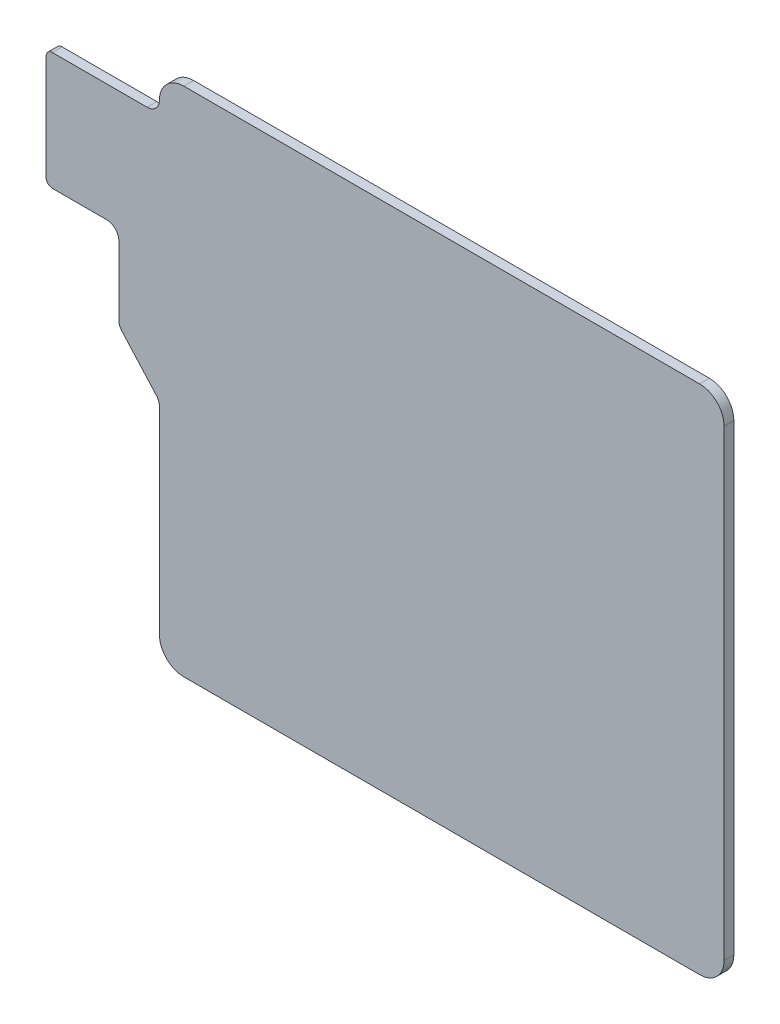
ISO-10303-21;
HEADER;
FILE_DESCRIPTION(('STEP AP214'),'2;1');
FILE_NAME('part.step','',(''),(''),'','','');
FILE_SCHEMA(('AUTOMOTIVE_DESIGN { 1 0 10303 214 1 1 1 1 }'));
ENDSEC;
DATA;
#1=APPLICATION_CONTEXT('core data for automotive mechanical design processes');
#2=APPLICATION_PROTOCOL_DEFINITION('international standard','automotive_design',2000,#1);
#3=PRODUCT_CONTEXT('',#1,'mechanical');
#4=PRODUCT('Part','Part','',(#3));
#5=PRODUCT_RELATED_PRODUCT_CATEGORY('part','',(#4));
#6=PRODUCT_DEFINITION_FORMATION('','',#4);
#7=PRODUCT_DEFINITION_CONTEXT('part definition',#1,'design');
#8=PRODUCT_DEFINITION('design','',#6,#7);
#9=PRODUCT_DEFINITION_SHAPE('','',#8);
#10=(LENGTH_UNIT() NAMED_UNIT(*) SI_UNIT(.MILLI.,.METRE.));
#11=(NAMED_UNIT(*) PLANE_ANGLE_UNIT() SI_UNIT($,.RADIAN.));
#12=(NAMED_UNIT(*) SI_UNIT($,.STERADIAN.) SOLID_ANGLE_UNIT());
#13=UNCERTAINTY_MEASURE_WITH_UNIT(LENGTH_MEASURE(1.E-05),#10,'distance_accuracy_value','');
#14=(GEOMETRIC_REPRESENTATION_CONTEXT(3) GLOBAL_UNCERTAINTY_ASSIGNED_CONTEXT((#13)) GLOBAL_UNIT_ASSIGNED_CONTEXT((#10,
#11,#12)) REPRESENTATION_CONTEXT('',''));
#15=CARTESIAN_POINT('',(0.,0.,0.));
#16=DIRECTION('',(0.,0.,1.));
#17=DIRECTION('',(1.,0.,0.));
#18=AXIS2_PLACEMENT_3D('',#15,#16,#17);
#19=CARTESIAN_POINT('',(21.9068913831102,0.593864401539017,1.6));
#20=DIRECTION('',(0.,0.,-1.));
#21=DIRECTION('',(-1.,0.,0.));
#22=AXIS2_PLACEMENT_3D('',#19,#20,#21);
#23=CYLINDRICAL_SURFACE('',#22,4.);
#24=CARTESIAN_POINT('',(21.9068913831102,0.593864401539017,0.));
#25=DIRECTION('',(0.,0.,1.));
#26=DIRECTION('',(-1.,0.,0.));
#27=AXIS2_PLACEMENT_3D('',#24,#25,#26);
#28=CIRCLE('',#27,4.);
#29=CARTESIAN_POINT('',(17.9068913831102,0.593864401539017,0.));
#30=VERTEX_POINT('',#29);
#31=CARTESIAN_POINT('',(21.9068913831102,-3.40613559846098,0.));
#32=VERTEX_POINT('',#31);
#33=EDGE_CURVE('E199',#30,#32,#28,.T.);
#34=ORIENTED_EDGE('',*,*,#33,.T.);
#35=DIRECTION('',(0.,0.,-1.));
#36=VECTOR('',#35,1.);
#37=CARTESIAN_POINT('',(21.9068913831102,-3.40613559846098,1.6));
#38=LINE('',#37,#36);
#39=CARTESIAN_POINT('',(21.9068913831102,-3.40613559846098,1.6));
#40=VERTEX_POINT('',#39);
#41=EDGE_CURVE('E11',#40,#32,#38,.T.);
#42=ORIENTED_EDGE('',*,*,#41,.F.);
#43=CARTESIAN_POINT('',(21.9068913831102,0.593864401539017,1.6));
#44=DIRECTION('',(0.,0.,1.));
#45=DIRECTION('',(-1.,0.,0.));
#46=AXIS2_PLACEMENT_3D('',#43,#44,#45);
#47=CIRCLE('',#46,4.);
#48=CARTESIAN_POINT('',(17.9068913831102,0.593864401539017,1.6));
#49=VERTEX_POINT('',#48);
#50=EDGE_CURVE('E235',#49,#40,#47,.T.);
#51=ORIENTED_EDGE('',*,*,#50,.F.);
#52=DIRECTION('',(0.,0.,-1.));
#53=VECTOR('',#52,1.);
#54=CARTESIAN_POINT('',(17.9068913831102,0.593864401539017,1.6));
#55=LINE('',#54,#53);
#56=EDGE_CURVE('E195',#49,#30,#55,.T.);
#57=ORIENTED_EDGE('',*,*,#56,.T.);
#58=EDGE_LOOP('',(#34,#42,#51,#57));
#59=FACE_BOUND('',#58,.T.);
#60=ADVANCED_FACE('F37',(#59),#23,.T.);
#61=CARTESIAN_POINT('',(21.9068913831102,-3.40613559846098,1.6));
#62=DIRECTION('',(0.,1.,0.));
#63=DIRECTION('',(-1.,0.,0.));
#64=AXIS2_PLACEMENT_3D('',#61,#62,#63);
#65=PLANE('',#64);
#66=DIRECTION('',(1.,0.,0.));
#67=VECTOR('',#66,1.);
#68=CARTESIAN_POINT('',(21.9068913831102,-3.40613559846098,0.));
#69=LINE('',#68,#67);
#70=CARTESIAN_POINT('',(106.36289138311,-3.40613559846098,0.));
#71=VERTEX_POINT('',#70);
#72=EDGE_CURVE('E202',#32,#71,#69,.T.);
#73=ORIENTED_EDGE('',*,*,#72,.T.);
#74=DIRECTION('',(0.,0.,-1.));
#75=VECTOR('',#74,1.);
#76=CARTESIAN_POINT('',(106.36289138311,-3.40613559846098,1.6));
#77=LINE('',#76,#75);
#78=CARTESIAN_POINT('',(106.36289138311,-3.40613559846098,1.6));
#79=VERTEX_POINT('',#78);
#80=EDGE_CURVE('E45',#79,#71,#77,.T.);
#81=ORIENTED_EDGE('',*,*,#80,.F.);
#82=DIRECTION('',(1.,0.,0.));
#83=VECTOR('',#82,1.);
#84=CARTESIAN_POINT('',(21.9068913831102,-3.40613559846098,1.6));
#85=LINE('',#84,#83);
#86=EDGE_CURVE('E129',#40,#79,#85,.T.);
#87=ORIENTED_EDGE('',*,*,#86,.F.);
#88=ORIENTED_EDGE('',*,*,#41,.T.);
#89=EDGE_LOOP('',(#73,#81,#87,#88));
#90=FACE_BOUND('',#89,.T.);
#91=ADVANCED_FACE('F348',(#90),#65,.F.);
#92=CARTESIAN_POINT('',(106.36289138311,0.593864401539021,1.6));
#93=DIRECTION('',(0.,0.,-1.));
#94=DIRECTION('',(-1.,0.,0.));
#95=AXIS2_PLACEMENT_3D('',#92,#93,#94);
#96=CYLINDRICAL_SURFACE('',#95,4.);
#97=CARTESIAN_POINT('',(106.36289138311,0.593864401539021,0.));
#98=DIRECTION('',(0.,0.,1.));
#99=DIRECTION('',(1.,0.,0.));
#100=AXIS2_PLACEMENT_3D('',#97,#98,#99);
#101=CIRCLE('',#100,4.);
#102=CARTESIAN_POINT('',(110.36289138311,0.593864401539021,0.));
#103=VERTEX_POINT('',#102);
#104=EDGE_CURVE('E204',#71,#103,#101,.T.);
#105=ORIENTED_EDGE('',*,*,#104,.T.);
#106=DIRECTION('',(0.,0.,-1.));
#107=VECTOR('',#106,1.);
#108=CARTESIAN_POINT('',(110.36289138311,0.593864401539021,1.6));
#109=LINE('',#108,#107);
#110=CARTESIAN_POINT('',(110.36289138311,0.593864401539021,1.6));
#111=VERTEX_POINT('',#110);
#112=EDGE_CURVE('E275',#111,#103,#109,.T.);
#113=ORIENTED_EDGE('',*,*,#112,.F.);
#114=CARTESIAN_POINT('',(106.36289138311,0.593864401539021,1.6));
#115=DIRECTION('',(0.,0.,1.));
#116=DIRECTION('',(1.,0.,0.));
#117=AXIS2_PLACEMENT_3D('',#114,#115,#116);
#118=CIRCLE('',#117,4.);
#119=EDGE_CURVE('E283',#79,#111,#118,.T.);
#120=ORIENTED_EDGE('',*,*,#119,.F.);
#121=ORIENTED_EDGE('',*,*,#80,.T.);
#122=EDGE_LOOP('',(#105,#113,#120,#121));
#123=FACE_BOUND('',#122,.T.);
#124=ADVANCED_FACE('F281',(#123),#96,.T.);
#125=CARTESIAN_POINT('',(110.36289138311,0.593864401539021,1.6));
#126=DIRECTION('',(-1.,0.,0.));
#127=DIRECTION('',(0.,0.,1.));
#128=AXIS2_PLACEMENT_3D('',#125,#126,#127);
#129=PLANE('',#128);
#130=DIRECTION('',(0.,1.,0.));
#131=VECTOR('',#130,1.);
#132=CARTESIAN_POINT('',(110.36289138311,0.593864401539021,0.));
#133=LINE('',#132,#131);
#134=CARTESIAN_POINT('',(110.36289138311,76.363864401539,0.));
#135=VERTEX_POINT('',#134);
#136=EDGE_CURVE('E206',#103,#135,#133,.T.);
#137=ORIENTED_EDGE('',*,*,#136,.T.);
#138=DIRECTION('',(0.,0.,-1.));
#139=VECTOR('',#138,1.);
#140=CARTESIAN_POINT('',(110.36289138311,76.363864401539,1.6));
#141=LINE('',#140,#139);
#142=CARTESIAN_POINT('',(110.36289138311,76.363864401539,1.6));
#143=VERTEX_POINT('',#142);
#144=EDGE_CURVE('E272',#143,#135,#141,.T.);
#145=ORIENTED_EDGE('',*,*,#144,.F.);
#146=DIRECTION('',(0.,1.,0.));
#147=VECTOR('',#146,1.);
#148=CARTESIAN_POINT('',(110.36289138311,0.593864401539021,1.6));
#149=LINE('',#148,#147);
#150=EDGE_CURVE('E301',#111,#143,#149,.T.);
#151=ORIENTED_EDGE('',*,*,#150,.F.);
#152=ORIENTED_EDGE('',*,*,#112,.T.);
#153=EDGE_LOOP('',(#137,#145,#151,#152));
#154=FACE_BOUND('',#153,.T.);
#155=ADVANCED_FACE('F292',(#154),#129,.F.);
#156=CARTESIAN_POINT('',(106.36289138311,76.363864401539,1.6));
#157=DIRECTION('',(0.,0.,-1.));
#158=DIRECTION('',(-1.,0.,0.));
#159=AXIS2_PLACEMENT_3D('',#156,#157,#158);
#160=CYLINDRICAL_SURFACE('',#159,4.);
#161=CARTESIAN_POINT('',(106.36289138311,76.363864401539,0.));
#162=DIRECTION('',(0.,0.,1.));
#163=DIRECTION('',(1.,0.,0.));
#164=AXIS2_PLACEMENT_3D('',#161,#162,#163);
#165=CIRCLE('',#164,4.);
#166=CARTESIAN_POINT('',(106.36289138311,80.363864401539,0.));
#167=VERTEX_POINT('',#166);
#168=EDGE_CURVE('E208',#135,#167,#165,.T.);
#169=ORIENTED_EDGE('',*,*,#168,.T.);
#170=DIRECTION('',(0.,0.,-1.));
#171=VECTOR('',#170,1.);
#172=CARTESIAN_POINT('',(106.36289138311,80.363864401539,1.6));
#173=LINE('',#172,#171);
#174=CARTESIAN_POINT('',(106.36289138311,80.363864401539,1.6));
#175=VERTEX_POINT('',#174);
#176=EDGE_CURVE('E269',#175,#167,#173,.T.);
#177=ORIENTED_EDGE('',*,*,#176,.F.);
#178=CARTESIAN_POINT('',(106.36289138311,76.363864401539,1.6));
#179=DIRECTION('',(0.,0.,1.));
#180=DIRECTION('',(1.,0.,0.));
#181=AXIS2_PLACEMENT_3D('',#178,#179,#180);
#182=CIRCLE('',#181,4.);
#183=EDGE_CURVE('E298',#143,#175,#182,.T.);
#184=ORIENTED_EDGE('',*,*,#183,.F.);
#185=ORIENTED_EDGE('',*,*,#144,.T.);
#186=EDGE_LOOP('',(#169,#177,#184,#185));
#187=FACE_BOUND('',#186,.T.);
#188=ADVANCED_FACE('F296',(#187),#160,.T.);
#189=CARTESIAN_POINT('',(106.36289138311,80.363864401539,1.6));
#190=DIRECTION('',(0.,-1.,0.));
#191=DIRECTION('',(1.,0.,0.));
#192=AXIS2_PLACEMENT_3D('',#189,#190,#191);
#193=PLANE('',#192);
#194=DIRECTION('',(-1.,0.,0.));
#195=VECTOR('',#194,1.);
#196=CARTESIAN_POINT('',(106.36289138311,80.363864401539,0.));
#197=LINE('',#196,#195);
#198=CARTESIAN_POINT('',(21.9067913831102,80.363864401539,0.));
#199=VERTEX_POINT('',#198);
#200=EDGE_CURVE('E210',#167,#199,#197,.T.);
#201=ORIENTED_EDGE('',*,*,#200,.T.);
#202=DIRECTION('',(0.,0.,-1.));
#203=VECTOR('',#202,1.);
#204=CARTESIAN_POINT('',(21.9067913831102,80.363864401539,1.6));
#205=LINE('',#204,#203);
#206=CARTESIAN_POINT('',(21.9067913831102,80.363864401539,1.6));
#207=VERTEX_POINT('',#206);
#208=EDGE_CURVE('E266',#207,#199,#205,.T.);
#209=ORIENTED_EDGE('',*,*,#208,.F.);
#210=DIRECTION('',(-1.,0.,0.));
#211=VECTOR('',#210,1.);
#212=CARTESIAN_POINT('',(106.36289138311,80.363864401539,1.6));
#213=LINE('',#212,#211);
#214=EDGE_CURVE('E300',#175,#207,#213,.T.);
#215=ORIENTED_EDGE('',*,*,#214,.F.);
#216=ORIENTED_EDGE('',*,*,#176,.T.);
#217=EDGE_LOOP('',(#201,#209,#215,#216));
#218=FACE_BOUND('',#217,.T.);
#219=ADVANCED_FACE('F361',(#218),#193,.F.);
#220=CARTESIAN_POINT('',(21.9067913831102,76.363864401539,1.6));
#221=DIRECTION('',(0.,0.,-1.));
#222=DIRECTION('',(-1.,0.,0.));
#223=AXIS2_PLACEMENT_3D('',#220,#221,#222);
#224=CYLINDRICAL_SURFACE('',#223,4.);
#225=CARTESIAN_POINT('',(21.9067913831102,76.363864401539,0.));
#226=DIRECTION('',(0.,0.,1.));
#227=DIRECTION('',(1.,0.,0.));
#228=AXIS2_PLACEMENT_3D('',#225,#226,#227);
#229=CIRCLE('',#228,4.);
#230=CARTESIAN_POINT('',(17.9067913831102,76.363864401539,0.));
#231=VERTEX_POINT('',#230);
#232=EDGE_CURVE('E212',#199,#231,#229,.T.);
#233=ORIENTED_EDGE('',*,*,#232,.T.);
#234=DIRECTION('',(0.,0.,-1.));
#235=VECTOR('',#234,1.);
#236=CARTESIAN_POINT('',(17.9067913831102,76.363864401539,1.6));
#237=LINE('',#236,#235);
#238=CARTESIAN_POINT('',(17.9067913831102,76.363864401539,1.6));
#239=VERTEX_POINT('',#238);
#240=EDGE_CURVE('E263',#239,#231,#237,.T.);
#241=ORIENTED_EDGE('',*,*,#240,.F.);
#242=CARTESIAN_POINT('',(21.9067913831102,76.363864401539,1.6));
#243=DIRECTION('',(0.,0.,1.));
#244=DIRECTION('',(1.,0.,0.));
#245=AXIS2_PLACEMENT_3D('',#242,#243,#244);
#246=CIRCLE('',#245,4.);
#247=EDGE_CURVE('E303',#207,#239,#246,.T.);
#248=ORIENTED_EDGE('',*,*,#247,.F.);
#249=ORIENTED_EDGE('',*,*,#208,.T.);
#250=EDGE_LOOP('',(#233,#241,#248,#249));
#251=FACE_BOUND('',#250,.T.);
#252=ADVANCED_FACE('F364',(#251),#224,.T.);
#253=CARTESIAN_POINT('',(15.9067913831102,76.363864401539,1.6));
#254=DIRECTION('',(0.,0.,-1.));
#255=DIRECTION('',(-1.,0.,0.));
#256=AXIS2_PLACEMENT_3D('',#253,#254,#255);
#257=CYLINDRICAL_SURFACE('',#256,2.);
#258=CARTESIAN_POINT('',(15.9067913831102,76.363864401539,0.));
#259=DIRECTION('',(0.,0.,-1.));
#260=DIRECTION('',(-1.,0.,0.));
#261=AXIS2_PLACEMENT_3D('',#258,#259,#260);
#262=CIRCLE('',#261,2.);
#263=CARTESIAN_POINT('',(15.9067913831102,74.363864401539,0.));
#264=VERTEX_POINT('',#263);
#265=EDGE_CURVE('E214',#231,#264,#262,.T.);
#266=ORIENTED_EDGE('',*,*,#265,.T.);
#267=DIRECTION('',(0.,0.,-1.));
#268=VECTOR('',#267,1.);
#269=CARTESIAN_POINT('',(15.9067913831102,74.363864401539,1.6));
#270=LINE('',#269,#268);
#271=CARTESIAN_POINT('',(15.9067913831102,74.363864401539,1.6));
#272=VERTEX_POINT('',#271);
#273=EDGE_CURVE('E260',#272,#264,#270,.T.);
#274=ORIENTED_EDGE('',*,*,#273,.F.);
#275=CARTESIAN_POINT('',(15.9067913831102,76.363864401539,1.6));
#276=DIRECTION('',(0.,0.,-1.));
#277=DIRECTION('',(-1.,0.,0.));
#278=AXIS2_PLACEMENT_3D('',#275,#276,#277);
#279=CIRCLE('',#278,2.);
#280=EDGE_CURVE('E309',#239,#272,#279,.T.);
#281=ORIENTED_EDGE('',*,*,#280,.F.);
#282=ORIENTED_EDGE('',*,*,#240,.T.);
#283=EDGE_LOOP('',(#266,#274,#281,#282));
#284=FACE_BOUND('',#283,.T.);
#285=ADVANCED_FACE('F368',(#284),#257,.F.);
#286=CARTESIAN_POINT('',(15.9067913831102,74.363864401539,1.6));
#287=DIRECTION('',(0.,-1.,0.));
#288=DIRECTION('',(0.,0.,-1.));
#289=AXIS2_PLACEMENT_3D('',#286,#287,#288);
#290=PLANE('',#289);
#291=DIRECTION('',(-1.,0.,0.));
#292=VECTOR('',#291,1.);
#293=CARTESIAN_POINT('',(15.9067913831102,74.363864401539,0.));
#294=LINE('',#293,#292);
#295=CARTESIAN_POINT('',(0.364791383110206,74.363864401539,0.));
#296=VERTEX_POINT('',#295);
#297=EDGE_CURVE('E216',#264,#296,#294,.T.);
#298=ORIENTED_EDGE('',*,*,#297,.T.);
#299=DIRECTION('',(0.,0.,-1.));
#300=VECTOR('',#299,1.);
#301=CARTESIAN_POINT('',(0.364791383110206,74.363864401539,1.6));
#302=LINE('',#301,#300);
#303=CARTESIAN_POINT('',(0.364791383110206,74.363864401539,1.6));
#304=VERTEX_POINT('',#303);
#305=EDGE_CURVE('E257',#304,#296,#302,.T.);
#306=ORIENTED_EDGE('',*,*,#305,.F.);
#307=DIRECTION('',(-1.,0.,0.));
#308=VECTOR('',#307,1.);
#309=CARTESIAN_POINT('',(15.9067913831102,74.363864401539,1.6));
#310=LINE('',#309,#308);
#311=EDGE_CURVE('E311',#272,#304,#310,.T.);
#312=ORIENTED_EDGE('',*,*,#311,.F.);
#313=ORIENTED_EDGE('',*,*,#273,.T.);
#314=EDGE_LOOP('',(#298,#306,#312,#313));
#315=FACE_BOUND('',#314,.T.);
#316=ADVANCED_FACE('F372',(#315),#290,.F.);
#317=CARTESIAN_POINT('',(0.364791383110207,73.363864401539,1.6));
#318=DIRECTION('',(0.,0.,-1.));
#319=DIRECTION('',(-1.,0.,0.));
#320=AXIS2_PLACEMENT_3D('',#317,#318,#319);
#321=CYLINDRICAL_SURFACE('',#320,1.00000000000001);
#322=CARTESIAN_POINT('',(0.364791383110207,73.363864401539,0.));
#323=DIRECTION('',(0.,0.,1.));
#324=DIRECTION('',(1.,0.,0.));
#325=AXIS2_PLACEMENT_3D('',#322,#323,#324);
#326=CIRCLE('',#325,1.00000000000001);
#327=CARTESIAN_POINT('',(-0.635208616889801,73.363864401539,0.));
#328=VERTEX_POINT('',#327);
#329=EDGE_CURVE('E218',#296,#328,#326,.T.);
#330=ORIENTED_EDGE('',*,*,#329,.T.);
#331=DIRECTION('',(0.,0.,-1.));
#332=VECTOR('',#331,1.);
#333=CARTESIAN_POINT('',(-0.635208616889801,73.363864401539,1.6));
#334=LINE('',#333,#332);
#335=CARTESIAN_POINT('',(-0.635208616889801,73.363864401539,1.6));
#336=VERTEX_POINT('',#335);
#337=EDGE_CURVE('E254',#336,#328,#334,.T.);
#338=ORIENTED_EDGE('',*,*,#337,.F.);
#339=CARTESIAN_POINT('',(0.364791383110207,73.363864401539,1.6));
#340=DIRECTION('',(0.,0.,1.));
#341=DIRECTION('',(1.,0.,0.));
#342=AXIS2_PLACEMENT_3D('',#339,#340,#341);
#343=CIRCLE('',#342,1.00000000000001);
#344=EDGE_CURVE('E313',#304,#336,#343,.T.);
#345=ORIENTED_EDGE('',*,*,#344,.F.);
#346=ORIENTED_EDGE('',*,*,#305,.T.);
#347=EDGE_LOOP('',(#330,#338,#345,#346));
#348=FACE_BOUND('',#347,.T.);
#349=ADVANCED_FACE('F376',(#348),#321,.T.);
#350=CARTESIAN_POINT('',(-0.635208616889793,73.363864401539,1.6));
#351=DIRECTION('',(0.999999996115328,8.81438890945239E-05,0.));
#352=DIRECTION('',(-8.81438890945239E-05,0.999999996115328,0.));
#353=AXIS2_PLACEMENT_3D('',#350,#351,#352);
#354=PLANE('',#353);
#355=DIRECTION('',(8.81438890945239E-05,-0.999999996115328,0.));
#356=VECTOR('',#355,1.);
#357=CARTESIAN_POINT('',(-0.635208616889793,73.363864401539,0.));
#358=LINE('',#357,#356);
#359=CARTESIAN_POINT('',(-0.633687130449518,56.1024699929778,0.));
#360=VERTEX_POINT('',#359);
#361=EDGE_CURVE('E220',#328,#360,#358,.T.);
#362=ORIENTED_EDGE('',*,*,#361,.T.);
#363=DIRECTION('',(0.,0.,-1.));
#364=VECTOR('',#363,1.);
#365=CARTESIAN_POINT('',(-0.633687130449518,56.1024699929778,1.6));
#366=LINE('',#365,#364);
#367=CARTESIAN_POINT('',(-0.633687130449518,56.1024699929778,1.6));
#368=VERTEX_POINT('',#367);
#369=EDGE_CURVE('E251',#368,#360,#366,.T.);
#370=ORIENTED_EDGE('',*,*,#369,.F.);
#371=DIRECTION('',(8.81438890945239E-05,-0.999999996115328,0.));
#372=VECTOR('',#371,1.);
#373=CARTESIAN_POINT('',(-0.635208616889793,73.363864401539,1.6));
#374=LINE('',#373,#372);
#375=EDGE_CURVE('E315',#336,#368,#374,.T.);
#376=ORIENTED_EDGE('',*,*,#375,.F.);
#377=ORIENTED_EDGE('',*,*,#337,.T.);
#378=EDGE_LOOP('',(#362,#370,#376,#377));
#379=FACE_BOUND('',#378,.T.);
#380=ADVANCED_FACE('F380',(#379),#354,.F.);
#381=CARTESIAN_POINT('',(0.366312869550484,56.1024699929778,1.6));
#382=DIRECTION('',(0.,0.,-1.));
#383=DIRECTION('',(-1.,0.,0.));
#384=AXIS2_PLACEMENT_3D('',#381,#382,#383);
#385=CYLINDRICAL_SURFACE('',#384,1.);
#386=CARTESIAN_POINT('',(0.366312869550484,56.1024699929778,0.));
#387=DIRECTION('',(0.,0.,1.));
#388=DIRECTION('',(-1.,0.,0.));
#389=AXIS2_PLACEMENT_3D('',#386,#387,#388);
#390=CIRCLE('',#389,1.);
#391=CARTESIAN_POINT('',(0.366312869550483,55.1024699929778,0.));
#392=VERTEX_POINT('',#391);
#393=EDGE_CURVE('E222',#360,#392,#390,.T.);
#394=ORIENTED_EDGE('',*,*,#393,.T.);
#395=DIRECTION('',(0.,0.,-1.));
#396=VECTOR('',#395,1.);
#397=CARTESIAN_POINT('',(0.366312869550483,55.1024699929778,1.6));
#398=LINE('',#397,#396);
#399=CARTESIAN_POINT('',(0.366312869550483,55.1024699929778,1.6));
#400=VERTEX_POINT('',#399);
#401=EDGE_CURVE('E248',#400,#392,#398,.T.);
#402=ORIENTED_EDGE('',*,*,#401,.F.);
#403=CARTESIAN_POINT('',(0.366312869550484,56.1024699929778,1.6));
#404=DIRECTION('',(0.,0.,1.));
#405=DIRECTION('',(-1.,0.,0.));
#406=AXIS2_PLACEMENT_3D('',#403,#404,#405);
#407=CIRCLE('',#406,1.);
#408=EDGE_CURVE('E317',#368,#400,#407,.T.);
#409=ORIENTED_EDGE('',*,*,#408,.F.);
#410=ORIENTED_EDGE('',*,*,#369,.T.);
#411=EDGE_LOOP('',(#394,#402,#409,#410));
#412=FACE_BOUND('',#411,.T.);
#413=ADVANCED_FACE('F384',(#412),#385,.T.);
#414=CARTESIAN_POINT('',(9.26811286955048,55.1024699929778,1.6));
#415=DIRECTION('',(0.,1.,0.));
#416=DIRECTION('',(0.,0.,1.));
#417=AXIS2_PLACEMENT_3D('',#414,#415,#416);
#418=PLANE('',#417);
#419=DIRECTION('',(1.,0.,0.));
#420=VECTOR('',#419,1.);
#421=CARTESIAN_POINT('',(9.26811286955048,55.1024699929778,0.));
#422=LINE('',#421,#420);
#423=CARTESIAN_POINT('',(9.26811286955048,55.1024699929778,0.));
#424=VERTEX_POINT('',#423);
#425=EDGE_CURVE('E224',#392,#424,#422,.T.);
#426=ORIENTED_EDGE('',*,*,#425,.T.);
#427=DIRECTION('',(0.,0.,-1.));
#428=VECTOR('',#427,1.);
#429=CARTESIAN_POINT('',(9.26811286955048,55.1024699929778,1.6));
#430=LINE('',#429,#428);
#431=CARTESIAN_POINT('',(9.26811286955048,55.1024699929778,1.6));
#432=VERTEX_POINT('',#431);
#433=EDGE_CURVE('E245',#432,#424,#430,.T.);
#434=ORIENTED_EDGE('',*,*,#433,.F.);
#435=DIRECTION('',(1.,0.,0.));
#436=VECTOR('',#435,1.);
#437=CARTESIAN_POINT('',(9.26811286955048,55.1024699929778,1.6));
#438=LINE('',#437,#436);
#439=EDGE_CURVE('E319',#400,#432,#438,.T.);
#440=ORIENTED_EDGE('',*,*,#439,.F.);
#441=ORIENTED_EDGE('',*,*,#401,.T.);
#442=EDGE_LOOP('',(#426,#434,#440,#441));
#443=FACE_BOUND('',#442,.T.);
#444=ADVANCED_FACE('F388',(#443),#418,.F.);
#445=CARTESIAN_POINT('',(9.26811286955049,53.1024699929778,1.6));
#446=DIRECTION('',(0.,0.,-1.));
#447=DIRECTION('',(-1.,0.,0.));
#448=AXIS2_PLACEMENT_3D('',#445,#446,#447);
#449=CYLINDRICAL_SURFACE('',#448,2.);
#450=CARTESIAN_POINT('',(9.26811286955049,53.1024699929778,0.));
#451=DIRECTION('',(0.,0.,-1.));
#452=DIRECTION('',(1.,0.,0.));
#453=AXIS2_PLACEMENT_3D('',#450,#451,#452);
#454=CIRCLE('',#453,2.);
#455=CARTESIAN_POINT('',(11.2681128695505,53.1024699929778,0.));
#456=VERTEX_POINT('',#455);
#457=EDGE_CURVE('E226',#424,#456,#454,.T.);
#458=ORIENTED_EDGE('',*,*,#457,.T.);
#459=DIRECTION('',(0.,0.,-1.));
#460=VECTOR('',#459,1.);
#461=CARTESIAN_POINT('',(11.2681128695505,53.1024699929778,1.6));
#462=LINE('',#461,#460);
#463=CARTESIAN_POINT('',(11.2681128695505,53.1024699929778,1.6));
#464=VERTEX_POINT('',#463);
#465=EDGE_CURVE('E242',#464,#456,#462,.T.);
#466=ORIENTED_EDGE('',*,*,#465,.F.);
#467=CARTESIAN_POINT('',(9.26811286955049,53.1024699929778,1.6));
#468=DIRECTION('',(0.,0.,-1.));
#469=DIRECTION('',(1.,0.,0.));
#470=AXIS2_PLACEMENT_3D('',#467,#468,#469);
#471=CIRCLE('',#470,2.);
#472=EDGE_CURVE('E321',#432,#464,#471,.T.);
#473=ORIENTED_EDGE('',*,*,#472,.F.);
#474=ORIENTED_EDGE('',*,*,#433,.T.);
#475=EDGE_LOOP('',(#458,#466,#473,#474));
#476=FACE_BOUND('',#475,.T.);
#477=ADVANCED_FACE('F392',(#476),#449,.F.);
#478=CARTESIAN_POINT('',(11.2681128695505,41.8682699929778,1.6));
#479=DIRECTION('',(1.,0.,0.));
#480=DIRECTION('',(0.,0.,-1.));
#481=AXIS2_PLACEMENT_3D('',#478,#479,#480);
#482=PLANE('',#481);
#483=DIRECTION('',(0.,-1.,0.));
#484=VECTOR('',#483,1.);
#485=CARTESIAN_POINT('',(11.2681128695505,41.8682699929778,0.));
#486=LINE('',#485,#484);
#487=CARTESIAN_POINT('',(11.2681128695505,41.8682699929778,0.));
#488=VERTEX_POINT('',#487);
#489=EDGE_CURVE('E228',#456,#488,#486,.T.);
#490=ORIENTED_EDGE('',*,*,#489,.T.);
#491=DIRECTION('',(0.,0.,-1.));
#492=VECTOR('',#491,1.);
#493=CARTESIAN_POINT('',(11.2681128695505,41.8682699929778,1.6));
#494=LINE('',#493,#492);
#495=CARTESIAN_POINT('',(11.2681128695505,41.8682699929778,1.6));
#496=VERTEX_POINT('',#495);
#497=EDGE_CURVE('E239',#496,#488,#494,.T.);
#498=ORIENTED_EDGE('',*,*,#497,.F.);
#499=DIRECTION('',(0.,-1.,0.));
#500=VECTOR('',#499,1.);
#501=CARTESIAN_POINT('',(11.2681128695505,41.8682699929778,1.6));
#502=LINE('',#501,#500);
#503=EDGE_CURVE('E323',#464,#496,#502,.T.);
#504=ORIENTED_EDGE('',*,*,#503,.F.);
#505=ORIENTED_EDGE('',*,*,#465,.T.);
#506=EDGE_LOOP('',(#490,#498,#504,#505));
#507=FACE_BOUND('',#506,.T.);
#508=ADVANCED_FACE('F329',(#507),#482,.F.);
#509=CARTESIAN_POINT('',(13.2681128695504,41.8682699929778,1.6));
#510=DIRECTION('',(0.,0.,-1.));
#511=DIRECTION('',(-1.,0.,0.));
#512=AXIS2_PLACEMENT_3D('',#509,#510,#511);
#513=CYLINDRICAL_SURFACE('',#512,1.99999999999994);
#514=CARTESIAN_POINT('',(13.2681128695504,41.8682699929778,0.));
#515=DIRECTION('',(0.,0.,1.));
#516=DIRECTION('',(-1.,0.,0.));
#517=AXIS2_PLACEMENT_3D('',#514,#515,#516);
#518=CIRCLE('',#517,1.99999999999994);
#519=CARTESIAN_POINT('',(11.7794897770882,40.5326048820357,0.));
#520=VERTEX_POINT('',#519);
#521=EDGE_CURVE('E230',#488,#520,#518,.T.);
#522=ORIENTED_EDGE('',*,*,#521,.T.);
#523=DIRECTION('',(0.,0.,-1.));
#524=VECTOR('',#523,1.);
#525=CARTESIAN_POINT('',(11.7794897770882,40.5326048820357,1.6));
#526=LINE('',#525,#524);
#527=CARTESIAN_POINT('',(11.7794897770882,40.5326048820357,1.6));
#528=VERTEX_POINT('',#527);
#529=EDGE_CURVE('E190',#528,#520,#526,.T.);
#530=ORIENTED_EDGE('',*,*,#529,.F.);
#531=CARTESIAN_POINT('',(13.2681128695504,41.8682699929778,1.6));
#532=DIRECTION('',(0.,0.,1.));
#533=DIRECTION('',(-1.,0.,0.));
#534=AXIS2_PLACEMENT_3D('',#531,#532,#533);
#535=CIRCLE('',#534,1.99999999999994);
#536=EDGE_CURVE('E181',#496,#528,#535,.T.);
#537=ORIENTED_EDGE('',*,*,#536,.F.);
#538=ORIENTED_EDGE('',*,*,#497,.T.);
#539=EDGE_LOOP('',(#522,#530,#537,#538));
#540=FACE_BOUND('',#539,.T.);
#541=ADVANCED_FACE('F333',(#540),#513,.T.);
#542=CARTESIAN_POINT('',(17.3309146776968,34.3454407228346,1.6));
#543=DIRECTION('',(0.744311546231156,0.667832555471044,0.));
#544=DIRECTION('',(-0.667832555471044,0.744311546231156,0.));
#545=AXIS2_PLACEMENT_3D('',#542,#543,#544);
#546=PLANE('',#545);
#547=DIRECTION('',(0.667832555471044,-0.744311546231156,0.));
#548=VECTOR('',#547,1.);
#549=CARTESIAN_POINT('',(17.3309146776968,34.3454407228346,0.));
#550=LINE('',#549,#548);
#551=CARTESIAN_POINT('',(17.3309146776968,34.3454407228346,0.));
#552=VERTEX_POINT('',#551);
#553=EDGE_CURVE('E189',#520,#552,#550,.T.);
#554=ORIENTED_EDGE('',*,*,#553,.T.);
#555=DIRECTION('',(0.,0.,-1.));
#556=VECTOR('',#555,1.);
#557=CARTESIAN_POINT('',(17.3309146776968,34.3454407228346,1.6));
#558=LINE('',#557,#556);
#559=CARTESIAN_POINT('',(17.3309146776968,34.3454407228346,1.6));
#560=VERTEX_POINT('',#559);
#561=EDGE_CURVE('E186',#560,#552,#558,.T.);
#562=ORIENTED_EDGE('',*,*,#561,.F.);
#563=DIRECTION('',(0.667832555471044,-0.744311546231156,0.));
#564=VECTOR('',#563,1.);
#565=CARTESIAN_POINT('',(17.3309146776968,34.3454407228346,1.6));
#566=LINE('',#565,#564);
#567=EDGE_CURVE('E175',#528,#560,#566,.T.);
#568=ORIENTED_EDGE('',*,*,#567,.F.);
#569=ORIENTED_EDGE('',*,*,#529,.T.);
#570=EDGE_LOOP('',(#554,#562,#568,#569));
#571=FACE_BOUND('',#570,.T.);
#572=ADVANCED_FACE('F187',(#571),#546,.F.);
#573=CARTESIAN_POINT('',(15.9067913831102,32.941064401539,1.6));
#574=DIRECTION('',(0.,0.,-1.));
#575=DIRECTION('',(-1.,0.,0.));
#576=AXIS2_PLACEMENT_3D('',#573,#574,#575);
#577=CYLINDRICAL_SURFACE('',#576,2.0001);
#578=CARTESIAN_POINT('',(15.9067913831102,32.941064401539,0.));
#579=DIRECTION('',(0.,0.,-1.));
#580=DIRECTION('',(1.,0.,0.));
#581=AXIS2_PLACEMENT_3D('',#578,#579,#580);
#582=CIRCLE('',#581,2.0001);
#583=CARTESIAN_POINT('',(17.9068913831102,32.941064401539,0.));
#584=VERTEX_POINT('',#583);
#585=EDGE_CURVE('E115',#552,#584,#582,.T.);
#586=ORIENTED_EDGE('',*,*,#585,.T.);
#587=DIRECTION('',(0.,0.,-1.));
#588=VECTOR('',#587,1.);
#589=CARTESIAN_POINT('',(17.9068913831102,32.941064401539,1.6));
#590=LINE('',#589,#588);
#591=CARTESIAN_POINT('',(17.9068913831102,32.941064401539,1.6));
#592=VERTEX_POINT('',#591);
#593=EDGE_CURVE('E191',#592,#584,#590,.T.);
#594=ORIENTED_EDGE('',*,*,#593,.F.);
#595=CARTESIAN_POINT('',(15.9067913831102,32.941064401539,1.6));
#596=DIRECTION('',(0.,0.,-1.));
#597=DIRECTION('',(1.,0.,0.));
#598=AXIS2_PLACEMENT_3D('',#595,#596,#597);
#599=CIRCLE('',#598,2.0001);
#600=EDGE_CURVE('E179',#560,#592,#599,.T.);
#601=ORIENTED_EDGE('',*,*,#600,.F.);
#602=ORIENTED_EDGE('',*,*,#561,.T.);
#603=EDGE_LOOP('',(#586,#594,#601,#602));
#604=FACE_BOUND('',#603,.T.);
#605=ADVANCED_FACE('F193',(#604),#577,.F.);
#606=CARTESIAN_POINT('',(17.9068913831102,0.593864401539017,1.6));
#607=DIRECTION('',(1.,0.,0.));
#608=DIRECTION('',(0.,0.,-1.));
#609=AXIS2_PLACEMENT_3D('',#606,#607,#608);
#610=PLANE('',#609);
#611=DIRECTION('',(0.,-1.,0.));
#612=VECTOR('',#611,1.);
#613=CARTESIAN_POINT('',(17.9068913831102,0.593864401539017,0.));
#614=LINE('',#613,#612);
#615=EDGE_CURVE('E121',#584,#30,#614,.T.);
#616=ORIENTED_EDGE('',*,*,#615,.T.);
#617=ORIENTED_EDGE('',*,*,#56,.F.);
#618=DIRECTION('',(0.,-1.,0.));
#619=VECTOR('',#618,1.);
#620=CARTESIAN_POINT('',(17.9068913831102,0.593864401539017,1.6));
#621=LINE('',#620,#619);
#622=EDGE_CURVE('E53',#592,#49,#621,.T.);
#623=ORIENTED_EDGE('',*,*,#622,.F.);
#624=ORIENTED_EDGE('',*,*,#593,.T.);
#625=EDGE_LOOP('',(#616,#617,#623,#624));
#626=FACE_BOUND('',#625,.T.);
#627=ADVANCED_FACE('F337',(#626),#610,.F.);
#628=CARTESIAN_POINT('',(21.9068913831102,0.593864401539017,1.6));
#629=DIRECTION('',(0.,0.,-1.));
#630=DIRECTION('',(-1.,0.,0.));
#631=AXIS2_PLACEMENT_3D('',#628,#629,#630);
#632=PLANE('',#631);
#633=ORIENTED_EDGE('',*,*,#50,.T.);
#634=ORIENTED_EDGE('',*,*,#86,.T.);
#635=ORIENTED_EDGE('',*,*,#119,.T.);
#636=ORIENTED_EDGE('',*,*,#150,.T.);
#637=ORIENTED_EDGE('',*,*,#183,.T.);
#638=ORIENTED_EDGE('',*,*,#214,.T.);
#639=ORIENTED_EDGE('',*,*,#247,.T.);
#640=ORIENTED_EDGE('',*,*,#280,.T.);
#641=ORIENTED_EDGE('',*,*,#311,.T.);
#642=ORIENTED_EDGE('',*,*,#344,.T.);
#643=ORIENTED_EDGE('',*,*,#375,.T.);
#644=ORIENTED_EDGE('',*,*,#408,.T.);
#645=ORIENTED_EDGE('',*,*,#439,.T.);
#646=ORIENTED_EDGE('',*,*,#472,.T.);
#647=ORIENTED_EDGE('',*,*,#503,.T.);
#648=ORIENTED_EDGE('',*,*,#536,.T.);
#649=ORIENTED_EDGE('',*,*,#567,.T.);
#650=ORIENTED_EDGE('',*,*,#600,.T.);
#651=ORIENTED_EDGE('',*,*,#622,.T.);
#652=EDGE_LOOP('',(#633,#634,#635,#636,#637,#638,#639,#640,#641,#642,#643,#644,#645,#646,#647,
#648,#649,#650,#651));
#653=FACE_BOUND('',#652,.T.);
#654=ADVANCED_FACE('F177',(#653),#632,.F.);
#655=CARTESIAN_POINT('',(21.9068913831102,0.593864401539017,0.));
#656=DIRECTION('',(0.,0.,-1.));
#657=DIRECTION('',(-1.,0.,0.));
#658=AXIS2_PLACEMENT_3D('',#655,#656,#657);
#659=PLANE('',#658);
#660=ORIENTED_EDGE('',*,*,#33,.F.);
#661=ORIENTED_EDGE('',*,*,#615,.F.);
#662=ORIENTED_EDGE('',*,*,#585,.F.);
#663=ORIENTED_EDGE('',*,*,#553,.F.);
#664=ORIENTED_EDGE('',*,*,#521,.F.);
#665=ORIENTED_EDGE('',*,*,#489,.F.);
#666=ORIENTED_EDGE('',*,*,#457,.F.);
#667=ORIENTED_EDGE('',*,*,#425,.F.);
#668=ORIENTED_EDGE('',*,*,#393,.F.);
#669=ORIENTED_EDGE('',*,*,#361,.F.);
#670=ORIENTED_EDGE('',*,*,#329,.F.);
#671=ORIENTED_EDGE('',*,*,#297,.F.);
#672=ORIENTED_EDGE('',*,*,#265,.F.);
#673=ORIENTED_EDGE('',*,*,#232,.F.);
#674=ORIENTED_EDGE('',*,*,#200,.F.);
#675=ORIENTED_EDGE('',*,*,#168,.F.);
#676=ORIENTED_EDGE('',*,*,#136,.F.);
#677=ORIENTED_EDGE('',*,*,#104,.F.);
#678=ORIENTED_EDGE('',*,*,#72,.F.);
#679=EDGE_LOOP('',(#660,#661,#662,#663,#664,#665,#666,#667,#668,#669,#670,#671,#672,#673,#674,
#675,#676,#677,#678));
#680=FACE_BOUND('',#679,.T.);
#681=ADVANCED_FACE('F287',(#680),#659,.T.);
#682=CLOSED_SHELL('',(#60,#91,#124,#155,#188,#219,#252,#285,#316,#349,#380,#413,#444,#477,#508,
#541,#572,#605,#627,#654,#681));
#683=MANIFOLD_SOLID_BREP('B2',#682);
#684=ADVANCED_BREP_SHAPE_REPRESENTATION('',(#18,#683),#14);
#685=SHAPE_DEFINITION_REPRESENTATION(#9,#684);
ENDSEC;
END-ISO-10303-21;
